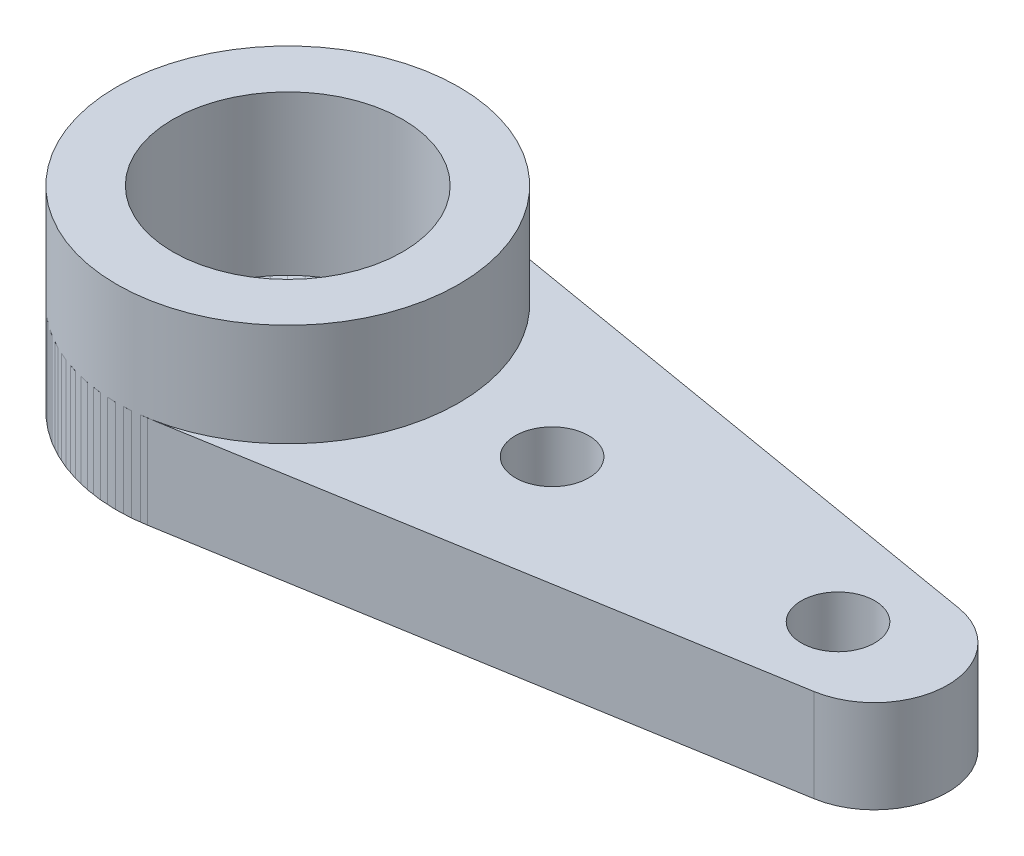
ISO-10303-21;
HEADER;
FILE_DESCRIPTION(('STEP AP214'),'2;1');
FILE_NAME('part.step','',(''),(''),'','','');
FILE_SCHEMA(('AUTOMOTIVE_DESIGN { 1 0 10303 214 1 1 1 1 }'));
ENDSEC;
DATA;
#1=APPLICATION_CONTEXT('core data for automotive mechanical design processes');
#2=APPLICATION_PROTOCOL_DEFINITION('international standard','automotive_design',2000,#1);
#3=PRODUCT_CONTEXT('',#1,'mechanical');
#4=PRODUCT('Part','Part','',(#3));
#5=PRODUCT_RELATED_PRODUCT_CATEGORY('part','',(#4));
#6=PRODUCT_DEFINITION_FORMATION('','',#4);
#7=PRODUCT_DEFINITION_CONTEXT('part definition',#1,'design');
#8=PRODUCT_DEFINITION('design','',#6,#7);
#9=PRODUCT_DEFINITION_SHAPE('','',#8);
#10=(LENGTH_UNIT() NAMED_UNIT(*) SI_UNIT(.MILLI.,.METRE.));
#11=(NAMED_UNIT(*) PLANE_ANGLE_UNIT() SI_UNIT($,.RADIAN.));
#12=(NAMED_UNIT(*) SI_UNIT($,.STERADIAN.) SOLID_ANGLE_UNIT());
#13=UNCERTAINTY_MEASURE_WITH_UNIT(LENGTH_MEASURE(1.E-05),#10,'distance_accuracy_value','');
#14=(GEOMETRIC_REPRESENTATION_CONTEXT(3) GLOBAL_UNCERTAINTY_ASSIGNED_CONTEXT((#13)) GLOBAL_UNIT_ASSIGNED_CONTEXT((#10,
#11,#12)) REPRESENTATION_CONTEXT('',''));
#15=CARTESIAN_POINT('',(0.,0.,0.));
#16=DIRECTION('',(0.,0.,1.));
#17=DIRECTION('',(1.,0.,0.));
#18=AXIS2_PLACEMENT_3D('',#15,#16,#17);
#19=CARTESIAN_POINT('',(0.,1.9,0.));
#20=DIRECTION('',(0.,-1.,0.));
#21=DIRECTION('',(0.,0.,-1.));
#22=AXIS2_PLACEMENT_3D('',#19,#20,#21);
#23=CYLINDRICAL_SURFACE('',#22,1.5);
#24=CARTESIAN_POINT('',(0.,0.,0.));
#25=DIRECTION('',(0.,-1.,0.));
#26=DIRECTION('',(0.,0.,-1.));
#27=AXIS2_PLACEMENT_3D('',#24,#25,#26);
#28=CIRCLE('',#27,1.5);
#29=CARTESIAN_POINT('',(0.,0.,-1.5));
#30=VERTEX_POINT('',#29);
#31=EDGE_CURVE('E112',#30,#30,#28,.T.);
#32=CARTESIAN_POINT('',(0.,0.75,0.));
#33=DIRECTION('',(0.,1.,0.));
#34=DIRECTION('',(0.,0.,1.));
#35=AXIS2_PLACEMENT_3D('',#32,#33,#34);
#36=CIRCLE('',#35,1.5);
#37=CARTESIAN_POINT('',(0.,0.75,-1.5));
#38=VERTEX_POINT('',#37);
#39=EDGE_CURVE('E118',#38,#38,#36,.F.);
#40=CARTESIAN_POINT('',(0.,0.,-1.5));
#41=CARTESIAN_POINT('',(0.,0.00781250000000001,-1.5));
#42=CARTESIAN_POINT('',(0.,0.015625,-1.5));
#43=CARTESIAN_POINT('',(0.,0.03125,-1.5));
#44=CARTESIAN_POINT('',(0.,0.0390625,-1.5));
#45=CARTESIAN_POINT('',(0.,0.0546875,-1.5));
#46=CARTESIAN_POINT('',(0.,0.0625000000000001,-1.5));
#47=CARTESIAN_POINT('',(0.,0.0781250000000001,-1.5));
#48=CARTESIAN_POINT('',(0.,0.0859375000000001,-1.5));
#49=CARTESIAN_POINT('',(0.,0.1015625,-1.5));
#50=CARTESIAN_POINT('',(0.,0.109375,-1.5));
#51=CARTESIAN_POINT('',(0.,0.125,-1.5));
#52=CARTESIAN_POINT('',(0.,0.1328125,-1.5));
#53=CARTESIAN_POINT('',(0.,0.1484375,-1.5));
#54=CARTESIAN_POINT('',(0.,0.15625,-1.5));
#55=CARTESIAN_POINT('',(0.,0.171875,-1.5));
#56=CARTESIAN_POINT('',(0.,0.1796875,-1.5));
#57=CARTESIAN_POINT('',(0.,0.1953125,-1.5));
#58=CARTESIAN_POINT('',(0.,0.203125,-1.5));
#59=CARTESIAN_POINT('',(0.,0.21875,-1.5));
#60=CARTESIAN_POINT('',(0.,0.2265625,-1.5));
#61=CARTESIAN_POINT('',(0.,0.2421875,-1.5));
#62=CARTESIAN_POINT('',(0.,0.25,-1.5));
#63=CARTESIAN_POINT('',(0.,0.265625,-1.5));
#64=CARTESIAN_POINT('',(0.,0.2734375,-1.5));
#65=CARTESIAN_POINT('',(0.,0.2890625,-1.5));
#66=CARTESIAN_POINT('',(0.,0.296875,-1.5));
#67=CARTESIAN_POINT('',(0.,0.3125,-1.5));
#68=CARTESIAN_POINT('',(0.,0.3203125,-1.5));
#69=CARTESIAN_POINT('',(0.,0.3359375,-1.5));
#70=CARTESIAN_POINT('',(0.,0.34375,-1.5));
#71=CARTESIAN_POINT('',(0.,0.359375,-1.5));
#72=CARTESIAN_POINT('',(0.,0.3671875,-1.5));
#73=CARTESIAN_POINT('',(0.,0.3828125,-1.5));
#74=CARTESIAN_POINT('',(0.,0.390625,-1.5));
#75=CARTESIAN_POINT('',(0.,0.40625,-1.5));
#76=CARTESIAN_POINT('',(0.,0.4140625,-1.5));
#77=CARTESIAN_POINT('',(0.,0.4296875,-1.5));
#78=CARTESIAN_POINT('',(0.,0.4375,-1.5));
#79=CARTESIAN_POINT('',(0.,0.453125,-1.5));
#80=CARTESIAN_POINT('',(0.,0.4609375,-1.5));
#81=CARTESIAN_POINT('',(0.,0.4765625,-1.5));
#82=CARTESIAN_POINT('',(0.,0.484375,-1.5));
#83=CARTESIAN_POINT('',(0.,0.5,-1.5));
#84=CARTESIAN_POINT('',(0.,0.5078125,-1.5));
#85=CARTESIAN_POINT('',(0.,0.5234375,-1.5));
#86=CARTESIAN_POINT('',(0.,0.53125,-1.5));
#87=CARTESIAN_POINT('',(0.,0.546875,-1.5));
#88=CARTESIAN_POINT('',(0.,0.5546875,-1.5));
#89=CARTESIAN_POINT('',(0.,0.5703125,-1.5));
#90=CARTESIAN_POINT('',(0.,0.578125,-1.5));
#91=CARTESIAN_POINT('',(0.,0.59375,-1.5));
#92=CARTESIAN_POINT('',(0.,0.6015625,-1.5));
#93=CARTESIAN_POINT('',(0.,0.6171875,-1.5));
#94=CARTESIAN_POINT('',(0.,0.625,-1.5));
#95=CARTESIAN_POINT('',(0.,0.640625,-1.5));
#96=CARTESIAN_POINT('',(0.,0.6484375,-1.5));
#97=CARTESIAN_POINT('',(0.,0.6640625,-1.5));
#98=CARTESIAN_POINT('',(0.,0.671875,-1.5));
#99=CARTESIAN_POINT('',(0.,0.6875,-1.5));
#100=CARTESIAN_POINT('',(0.,0.6953125,-1.5));
#101=CARTESIAN_POINT('',(0.,0.7109375,-1.5));
#102=CARTESIAN_POINT('',(0.,0.71875,-1.5));
#103=CARTESIAN_POINT('',(0.,0.734375,-1.5));
#104=CARTESIAN_POINT('',(0.,0.7421875,-1.5));
#105=CARTESIAN_POINT('',(0.,0.75,-1.5));
#106=B_SPLINE_CURVE_WITH_KNOTS('',3,(#40,#41,#42,#43,#44,#45,#46,#47,#48,#49,#50,#51,#52,#53,
#54,#55,#56,#57,#58,#59,#60,#61,#62,#63,#64,#65,#66,#67,#68,#69,#70,#71,#72,#73,#74,#75,#76,#77,
#78,#79,#80,#81,#82,#83,#84,#85,#86,#87,#88,#89,#90,#91,#92,#93,#94,#95,#96,#97,#98,#99,#100,
#101,#102,#103,#104,#105),.UNSPECIFIED.,.F.,.F.,(4,2,2,2,2,2,2,2,2,2,2,2,2,2,2,2,2,2,2,2,2,2,2,
2,2,2,2,2,2,2,2,2,4),(0.,0.0234375,0.046875,0.0703125000000001,0.0937500000000001,0.1171875,
0.140625,0.1640625,0.1875,0.2109375,0.234375,0.2578125,0.28125,0.3046875,0.328125,0.3515625,
0.375,0.3984375,0.421875,0.4453125,0.46875,0.4921875,0.515625,0.5390625,0.5625,0.5859375,
0.609375,0.6328125,0.65625,0.6796875,0.703125,0.7265625,0.75),.UNSPECIFIED.);
#107=EDGE_CURVE('BSEAM40',#30,#38,#106,.T.);
#108=ORIENTED_EDGE('',*,*,#31,.T.);
#109=ORIENTED_EDGE('',*,*,#39,.F.);
#110=ORIENTED_EDGE('',*,*,#107,.T.);
#111=ORIENTED_EDGE('',*,*,#107,.F.);
#112=EDGE_LOOP('',(#108,#110,#109,#111));
#113=FACE_BOUND('',#112,.T.);
#114=ADVANCED_FACE('F40',(#113),#23,.F.);
#115=CARTESIAN_POINT('',(0.,1.9,0.));
#116=DIRECTION('',(0.,-1.,0.));
#117=DIRECTION('',(0.,0.,-1.));
#118=AXIS2_PLACEMENT_3D('',#115,#116,#117);
#119=CYLINDRICAL_SURFACE('',#118,3.5);
#120=CARTESIAN_POINT('',(0.,0.,0.));
#121=DIRECTION('',(0.,-1.,0.));
#122=DIRECTION('',(0.,0.,-1.));
#123=AXIS2_PLACEMENT_3D('',#120,#121,#122);
#124=CIRCLE('',#123,3.5);
#125=CARTESIAN_POINT('',(0.583333333333334,0.,3.45104654014144));
#126=VERTEX_POINT('',#125);
#127=CARTESIAN_POINT('',(0.583333333333334,0.,-3.45104654014144));
#128=VERTEX_POINT('',#127);
#129=EDGE_CURVE('E108',#126,#128,#124,.T.);
#130=ORIENTED_EDGE('',*,*,#129,.F.);
#131=DIRECTION('',(0.,-1.,0.));
#132=VECTOR('',#131,1.);
#133=CARTESIAN_POINT('',(0.583333333333334,1.9,3.45104654014144));
#134=LINE('',#133,#132);
#135=CARTESIAN_POINT('',(0.583333333333334,1.9,3.45104654014144));
#136=VERTEX_POINT('',#135);
#137=EDGE_CURVE('E12',#136,#126,#134,.T.);
#138=ORIENTED_EDGE('',*,*,#137,.F.);
#139=CARTESIAN_POINT('',(0.,1.9,0.));
#140=DIRECTION('',(0.,-1.,0.));
#141=DIRECTION('',(0.,0.,-1.));
#142=AXIS2_PLACEMENT_3D('',#139,#140,#141);
#143=CIRCLE('',#142,3.5);
#144=CARTESIAN_POINT('',(0.583333333333334,1.9,-3.45104654014144));
#145=VERTEX_POINT('',#144);
#146=EDGE_CURVE('E101',#136,#145,#143,.T.);
#147=ORIENTED_EDGE('',*,*,#146,.T.);
#148=DIRECTION('',(0.,-1.,0.));
#149=VECTOR('',#148,1.);
#150=CARTESIAN_POINT('',(0.583333333333334,1.9,-3.45104654014144));
#151=LINE('',#150,#149);
#152=EDGE_CURVE('E84',#145,#128,#151,.T.);
#153=ORIENTED_EDGE('',*,*,#152,.T.);
#154=EDGE_LOOP('',(#130,#138,#147,#153));
#155=FACE_BOUND('',#154,.T.);
#156=ADVANCED_FACE('F42',(#155),#119,.T.);
#157=CARTESIAN_POINT('',(0.583333333333334,1.9,3.45104654014144));
#158=DIRECTION('',(0.166666666666667,0.,0.986013297183269));
#159=DIRECTION('',(0.986013297183269,0.,-0.166666666666667));
#160=AXIS2_PLACEMENT_3D('',#157,#158,#159);
#161=PLANE('',#160);
#162=DIRECTION('',(-0.986013297183269,0.,0.166666666666667));
#163=VECTOR('',#162,1.);
#164=CARTESIAN_POINT('',(0.583333333333334,0.,3.45104654014144));
#165=LINE('',#164,#163);
#166=CARTESIAN_POINT('',(12.25,0.,1.4790199457749));
#167=VERTEX_POINT('',#166);
#168=EDGE_CURVE('E103',#167,#126,#165,.T.);
#169=ORIENTED_EDGE('',*,*,#168,.F.);
#170=DIRECTION('',(0.,-1.,0.));
#171=VECTOR('',#170,1.);
#172=CARTESIAN_POINT('',(12.25,1.9,1.4790199457749));
#173=LINE('',#172,#171);
#174=CARTESIAN_POINT('',(12.25,1.9,1.4790199457749));
#175=VERTEX_POINT('',#174);
#176=EDGE_CURVE('E50',#175,#167,#173,.T.);
#177=ORIENTED_EDGE('',*,*,#176,.F.);
#178=DIRECTION('',(-0.986013297183269,0.,0.166666666666667));
#179=VECTOR('',#178,1.);
#180=CARTESIAN_POINT('',(0.583333333333334,1.9,3.45104654014144));
#181=LINE('',#180,#179);
#182=EDGE_CURVE('E98',#175,#136,#181,.T.);
#183=ORIENTED_EDGE('',*,*,#182,.T.);
#184=ORIENTED_EDGE('',*,*,#137,.T.);
#185=EDGE_LOOP('',(#169,#177,#183,#184));
#186=FACE_BOUND('',#185,.T.);
#187=ADVANCED_FACE('F144',(#186),#161,.T.);
#188=CARTESIAN_POINT('',(12.,1.9,0.));
#189=DIRECTION('',(0.,-1.,0.));
#190=DIRECTION('',(0.,0.,-1.));
#191=AXIS2_PLACEMENT_3D('',#188,#189,#190);
#192=CYLINDRICAL_SURFACE('',#191,1.5);
#193=CARTESIAN_POINT('',(12.,0.,0.));
#194=DIRECTION('',(0.,-1.,0.));
#195=DIRECTION('',(0.,0.,-1.));
#196=AXIS2_PLACEMENT_3D('',#193,#194,#195);
#197=CIRCLE('',#196,1.5);
#198=CARTESIAN_POINT('',(12.25,0.,-1.4790199457749));
#199=VERTEX_POINT('',#198);
#200=EDGE_CURVE('E92',#199,#167,#197,.T.);
#201=ORIENTED_EDGE('',*,*,#200,.F.);
#202=DIRECTION('',(0.,-1.,0.));
#203=VECTOR('',#202,1.);
#204=CARTESIAN_POINT('',(12.25,1.9,-1.4790199457749));
#205=LINE('',#204,#203);
#206=CARTESIAN_POINT('',(12.25,1.9,-1.4790199457749));
#207=VERTEX_POINT('',#206);
#208=EDGE_CURVE('E87',#207,#199,#205,.T.);
#209=ORIENTED_EDGE('',*,*,#208,.F.);
#210=CARTESIAN_POINT('',(12.,1.9,0.));
#211=DIRECTION('',(0.,-1.,0.));
#212=DIRECTION('',(0.,0.,-1.));
#213=AXIS2_PLACEMENT_3D('',#210,#211,#212);
#214=CIRCLE('',#213,1.5);
#215=EDGE_CURVE('E90',#207,#175,#214,.T.);
#216=ORIENTED_EDGE('',*,*,#215,.T.);
#217=ORIENTED_EDGE('',*,*,#176,.T.);
#218=EDGE_LOOP('',(#201,#209,#216,#217));
#219=FACE_BOUND('',#218,.T.);
#220=ADVANCED_FACE('F89',(#219),#192,.T.);
#221=CARTESIAN_POINT('',(0.583333333333334,1.9,-3.45104654014144));
#222=DIRECTION('',(0.166666666666667,0.,-0.986013297183269));
#223=DIRECTION('',(-0.986013297183269,0.,-0.166666666666667));
#224=AXIS2_PLACEMENT_3D('',#221,#222,#223);
#225=PLANE('',#224);
#226=DIRECTION('',(0.986013297183269,0.,0.166666666666667));
#227=VECTOR('',#226,1.);
#228=CARTESIAN_POINT('',(0.583333333333334,0.,-3.45104654014144));
#229=LINE('',#228,#227);
#230=EDGE_CURVE('E111',#128,#199,#229,.T.);
#231=ORIENTED_EDGE('',*,*,#230,.F.);
#232=ORIENTED_EDGE('',*,*,#152,.F.);
#233=DIRECTION('',(0.986013297183269,0.,0.166666666666667));
#234=VECTOR('',#233,1.);
#235=CARTESIAN_POINT('',(0.583333333333334,1.9,-3.45104654014144));
#236=LINE('',#235,#234);
#237=EDGE_CURVE('E97',#145,#207,#236,.T.);
#238=ORIENTED_EDGE('',*,*,#237,.T.);
#239=ORIENTED_EDGE('',*,*,#208,.T.);
#240=EDGE_LOOP('',(#231,#232,#238,#239));
#241=FACE_BOUND('',#240,.T.);
#242=ADVANCED_FACE('F100',(#241),#225,.T.);
#243=CARTESIAN_POINT('',(0.,1.9,0.));
#244=DIRECTION('',(0.,-1.,0.));
#245=DIRECTION('',(0.,0.,-1.));
#246=AXIS2_PLACEMENT_3D('',#243,#244,#245);
#247=PLANE('',#246);
#248=CARTESIAN_POINT('',(5.40759257124017,1.9,0.));
#249=DIRECTION('',(0.,-1.,0.));
#250=DIRECTION('',(0.,0.,-1.));
#251=AXIS2_PLACEMENT_3D('',#248,#249,#250);
#252=CIRCLE('',#251,0.75);
#253=CARTESIAN_POINT('',(5.40759257124017,1.9,-0.75));
#254=VERTEX_POINT('',#253);
#255=EDGE_CURVE('E170',#254,#254,#252,.T.);
#256=ORIENTED_EDGE('',*,*,#255,.T.);
#257=EDGE_LOOP('',(#256));
#258=FACE_BOUND('',#257,.T.);
#259=CARTESIAN_POINT('',(11.2575925712402,1.9,0.));
#260=DIRECTION('',(0.,-1.,0.));
#261=DIRECTION('',(0.,0.,-1.));
#262=AXIS2_PLACEMENT_3D('',#259,#260,#261);
#263=CIRCLE('',#262,0.75);
#264=CARTESIAN_POINT('',(11.2575925712402,1.9,-0.75));
#265=VERTEX_POINT('',#264);
#266=EDGE_CURVE('E125',#265,#265,#263,.T.);
#267=ORIENTED_EDGE('',*,*,#266,.T.);
#268=EDGE_LOOP('',(#267));
#269=FACE_BOUND('',#268,.T.);
#270=CARTESIAN_POINT('',(0.,1.9,0.));
#271=DIRECTION('',(0.,-1.,0.));
#272=DIRECTION('',(0.,0.,-1.));
#273=AXIS2_PLACEMENT_3D('',#270,#271,#272);
#274=CIRCLE('',#273,2.35);
#275=CARTESIAN_POINT('',(0.,1.9,2.35));
#276=VERTEX_POINT('',#275);
#277=EDGE_CURVE('E44',#276,#276,#274,.T.);
#278=ORIENTED_EDGE('',*,*,#277,.T.);
#279=EDGE_LOOP('',(#278));
#280=FACE_BOUND('',#279,.T.);
#281=ORIENTED_EDGE('',*,*,#146,.F.);
#282=ORIENTED_EDGE('',*,*,#182,.F.);
#283=ORIENTED_EDGE('',*,*,#215,.F.);
#284=ORIENTED_EDGE('',*,*,#237,.F.);
#285=EDGE_LOOP('',(#281,#282,#283,#284));
#286=FACE_BOUND('',#285,.T.);
#287=ADVANCED_FACE('F96',(#258,#269,#280,#286),#247,.F.);
#288=CARTESIAN_POINT('',(0.,0.,0.));
#289=DIRECTION('',(0.,-1.,0.));
#290=DIRECTION('',(0.,0.,-1.));
#291=AXIS2_PLACEMENT_3D('',#288,#289,#290);
#292=PLANE('',#291);
#293=CARTESIAN_POINT('',(5.40759257124017,0.,0.));
#294=DIRECTION('',(0.,-1.,0.));
#295=DIRECTION('',(0.,0.,-1.));
#296=AXIS2_PLACEMENT_3D('',#293,#294,#295);
#297=CIRCLE('',#296,0.75);
#298=CARTESIAN_POINT('',(5.40759257124017,0.,-0.75));
#299=VERTEX_POINT('',#298);
#300=EDGE_CURVE('E195',#299,#299,#297,.T.);
#301=ORIENTED_EDGE('',*,*,#300,.F.);
#302=EDGE_LOOP('',(#301));
#303=FACE_BOUND('',#302,.T.);
#304=CARTESIAN_POINT('',(11.2575925712402,0.,0.));
#305=DIRECTION('',(0.,-1.,0.));
#306=DIRECTION('',(0.,0.,-1.));
#307=AXIS2_PLACEMENT_3D('',#304,#305,#306);
#308=CIRCLE('',#307,0.75);
#309=CARTESIAN_POINT('',(11.2575925712402,0.,-0.75));
#310=VERTEX_POINT('',#309);
#311=EDGE_CURVE('E130',#310,#310,#308,.T.);
#312=ORIENTED_EDGE('',*,*,#311,.F.);
#313=EDGE_LOOP('',(#312));
#314=FACE_BOUND('',#313,.T.);
#315=ORIENTED_EDGE('',*,*,#31,.F.);
#316=EDGE_LOOP('',(#315));
#317=FACE_BOUND('',#316,.T.);
#318=ORIENTED_EDGE('',*,*,#129,.T.);
#319=ORIENTED_EDGE('',*,*,#230,.T.);
#320=ORIENTED_EDGE('',*,*,#200,.T.);
#321=ORIENTED_EDGE('',*,*,#168,.T.);
#322=EDGE_LOOP('',(#318,#319,#320,#321));
#323=FACE_BOUND('',#322,.T.);
#324=ADVANCED_FACE('F138',(#303,#314,#317,#323),#292,.T.);
#325=CARTESIAN_POINT('',(0.,0.75,0.));
#326=DIRECTION('',(0.,1.,0.));
#327=DIRECTION('',(0.,0.,1.));
#328=AXIS2_PLACEMENT_3D('',#325,#326,#327);
#329=CYLINDRICAL_SURFACE('',#328,2.35);
#330=CARTESIAN_POINT('',(0.,0.75,0.));
#331=DIRECTION('',(0.,1.,0.));
#332=DIRECTION('',(0.,0.,1.));
#333=AXIS2_PLACEMENT_3D('',#330,#331,#332);
#334=CIRCLE('',#333,2.35);
#335=CARTESIAN_POINT('',(0.,0.75,2.35));
#336=VERTEX_POINT('',#335);
#337=EDGE_CURVE('E120',#336,#336,#334,.T.);
#338=CARTESIAN_POINT('',(0.,0.75,2.35));
#339=CARTESIAN_POINT('',(0.,0.761979166666667,2.35));
#340=CARTESIAN_POINT('',(0.,0.773958333333334,2.35));
#341=CARTESIAN_POINT('',(0.,0.797916666666667,2.35));
#342=CARTESIAN_POINT('',(0.,0.809895833333333,2.35));
#343=CARTESIAN_POINT('',(0.,0.833854166666667,2.35));
#344=CARTESIAN_POINT('',(0.,0.845833333333334,2.35));
#345=CARTESIAN_POINT('',(0.,0.869791666666667,2.35));
#346=CARTESIAN_POINT('',(0.,0.881770833333334,2.35));
#347=CARTESIAN_POINT('',(0.,0.905729166666667,2.35));
#348=CARTESIAN_POINT('',(0.,0.917708333333334,2.35));
#349=CARTESIAN_POINT('',(0.,0.941666666666667,2.35));
#350=CARTESIAN_POINT('',(0.,0.953645833333334,2.35));
#351=CARTESIAN_POINT('',(0.,0.977604166666667,2.35));
#352=CARTESIAN_POINT('',(0.,0.989583333333333,2.35));
#353=CARTESIAN_POINT('',(0.,1.01354166666667,2.35));
#354=CARTESIAN_POINT('',(0.,1.02552083333333,2.35));
#355=CARTESIAN_POINT('',(0.,1.04947916666667,2.35));
#356=CARTESIAN_POINT('',(0.,1.06145833333333,2.35));
#357=CARTESIAN_POINT('',(0.,1.08541666666667,2.35));
#358=CARTESIAN_POINT('',(0.,1.09739583333333,2.35));
#359=CARTESIAN_POINT('',(0.,1.12135416666667,2.35));
#360=CARTESIAN_POINT('',(0.,1.13333333333333,2.35));
#361=CARTESIAN_POINT('',(0.,1.15729166666667,2.35));
#362=CARTESIAN_POINT('',(0.,1.16927083333333,2.35));
#363=CARTESIAN_POINT('',(0.,1.19322916666667,2.35));
#364=CARTESIAN_POINT('',(0.,1.20520833333333,2.35));
#365=CARTESIAN_POINT('',(0.,1.22916666666667,2.35));
#366=CARTESIAN_POINT('',(0.,1.24114583333333,2.35));
#367=CARTESIAN_POINT('',(0.,1.26510416666667,2.35));
#368=CARTESIAN_POINT('',(0.,1.27708333333333,2.35));
#369=CARTESIAN_POINT('',(0.,1.30104166666667,2.35));
#370=CARTESIAN_POINT('',(0.,1.31302083333333,2.35));
#371=CARTESIAN_POINT('',(0.,1.33697916666667,2.35));
#372=CARTESIAN_POINT('',(0.,1.34895833333333,2.35));
#373=CARTESIAN_POINT('',(0.,1.37291666666667,2.35));
#374=CARTESIAN_POINT('',(0.,1.38489583333333,2.35));
#375=CARTESIAN_POINT('',(0.,1.40885416666667,2.35));
#376=CARTESIAN_POINT('',(0.,1.42083333333333,2.35));
#377=CARTESIAN_POINT('',(0.,1.44479166666667,2.35));
#378=CARTESIAN_POINT('',(0.,1.45677083333333,2.35));
#379=CARTESIAN_POINT('',(0.,1.48072916666667,2.35));
#380=CARTESIAN_POINT('',(0.,1.49270833333333,2.35));
#381=CARTESIAN_POINT('',(0.,1.51666666666667,2.35));
#382=CARTESIAN_POINT('',(0.,1.52864583333333,2.35));
#383=CARTESIAN_POINT('',(0.,1.55260416666667,2.35));
#384=CARTESIAN_POINT('',(0.,1.56458333333333,2.35));
#385=CARTESIAN_POINT('',(0.,1.58854166666667,2.35));
#386=CARTESIAN_POINT('',(0.,1.60052083333333,2.35));
#387=CARTESIAN_POINT('',(0.,1.62447916666667,2.35));
#388=CARTESIAN_POINT('',(0.,1.63645833333333,2.35));
#389=CARTESIAN_POINT('',(0.,1.66041666666667,2.35));
#390=CARTESIAN_POINT('',(0.,1.67239583333333,2.35));
#391=CARTESIAN_POINT('',(0.,1.69635416666667,2.35));
#392=CARTESIAN_POINT('',(0.,1.70833333333333,2.35));
#393=CARTESIAN_POINT('',(0.,1.73229166666667,2.35));
#394=CARTESIAN_POINT('',(0.,1.74427083333333,2.35));
#395=CARTESIAN_POINT('',(0.,1.76822916666667,2.35));
#396=CARTESIAN_POINT('',(0.,1.78020833333333,2.35));
#397=CARTESIAN_POINT('',(0.,1.80416666666667,2.35));
#398=CARTESIAN_POINT('',(0.,1.81614583333333,2.35));
#399=CARTESIAN_POINT('',(0.,1.84010416666667,2.35));
#400=CARTESIAN_POINT('',(0.,1.85208333333333,2.35));
#401=CARTESIAN_POINT('',(0.,1.87604166666667,2.35));
#402=CARTESIAN_POINT('',(0.,1.88802083333333,2.35));
#403=CARTESIAN_POINT('',(0.,1.9,2.35));
#404=B_SPLINE_CURVE_WITH_KNOTS('',3,(#338,#339,#340,#341,#342,#343,#344,#345,#346,#347,#348,
#349,#350,#351,#352,#353,#354,#355,#356,#357,#358,#359,#360,#361,#362,#363,#364,#365,#366,#367,
#368,#369,#370,#371,#372,#373,#374,#375,#376,#377,#378,#379,#380,#381,#382,#383,#384,#385,#386,
#387,#388,#389,#390,#391,#392,#393,#394,#395,#396,#397,#398,#399,#400,#401,#402,#403),
.UNSPECIFIED.,.F.,.F.,(4,2,2,2,2,2,2,2,2,2,2,2,2,2,2,2,2,2,2,2,2,2,2,2,2,2,2,2,2,2,2,2,4),(0.,
0.0359375000000001,0.071875,0.1078125,0.14375,0.1796875,0.215625,0.2515625,0.2875,0.3234375,
0.359375,0.3953125,0.43125,0.4671875,0.503125,0.5390625,0.575,0.6109375,0.646875,0.6828125,
0.71875,0.7546875,0.790625,0.8265625,0.8625,0.8984375,0.934375,0.9703125,1.00625,1.0421875,
1.078125,1.1140625,1.15),.UNSPECIFIED.);
#405=EDGE_CURVE('BSEAM141',#336,#276,#404,.T.);
#406=ORIENTED_EDGE('',*,*,#337,.F.);
#407=ORIENTED_EDGE('',*,*,#277,.F.);
#408=ORIENTED_EDGE('',*,*,#405,.T.);
#409=ORIENTED_EDGE('',*,*,#405,.F.);
#410=EDGE_LOOP('',(#406,#408,#407,#409));
#411=FACE_BOUND('',#410,.T.);
#412=ADVANCED_FACE('F141',(#411),#329,.F.);
#413=CARTESIAN_POINT('',(0.,0.75,0.));
#414=DIRECTION('',(0.,1.,0.));
#415=DIRECTION('',(0.,0.,1.));
#416=AXIS2_PLACEMENT_3D('',#413,#414,#415);
#417=PLANE('',#416);
#418=ORIENTED_EDGE('',*,*,#337,.T.);
#419=EDGE_LOOP('',(#418));
#420=FACE_BOUND('',#419,.T.);
#421=ORIENTED_EDGE('',*,*,#39,.T.);
#422=EDGE_LOOP('',(#421));
#423=FACE_BOUND('',#422,.T.);
#424=ADVANCED_FACE('F176',(#420,#423),#417,.T.);
#425=CARTESIAN_POINT('',(11.2575925712402,4.,0.));
#426=DIRECTION('',(0.,-1.,0.));
#427=DIRECTION('',(0.,0.,-1.));
#428=AXIS2_PLACEMENT_3D('',#425,#426,#427);
#429=CYLINDRICAL_SURFACE('',#428,0.75);
#430=ORIENTED_EDGE('',*,*,#311,.T.);
#431=EDGE_LOOP('',(#430));
#432=FACE_BOUND('',#431,.T.);
#433=ORIENTED_EDGE('',*,*,#266,.F.);
#434=EDGE_LOOP('',(#433));
#435=FACE_BOUND('',#434,.T.);
#436=ADVANCED_FACE('F181',(#432,#435),#429,.F.);
#437=CARTESIAN_POINT('',(5.40759257124017,4.,0.));
#438=DIRECTION('',(0.,-1.,0.));
#439=DIRECTION('',(0.,0.,-1.));
#440=AXIS2_PLACEMENT_3D('',#437,#438,#439);
#441=CYLINDRICAL_SURFACE('',#440,0.75);
#442=ORIENTED_EDGE('',*,*,#300,.T.);
#443=EDGE_LOOP('',(#442));
#444=FACE_BOUND('',#443,.T.);
#445=ORIENTED_EDGE('',*,*,#255,.F.);
#446=EDGE_LOOP('',(#445));
#447=FACE_BOUND('',#446,.T.);
#448=ADVANCED_FACE('F184',(#444,#447),#441,.F.);
#449=CLOSED_SHELL('',(#114,#156,#187,#220,#242,#287,#324,#412,#424,#436,#448));
#450=MANIFOLD_SOLID_BREP('B2',#449);
#451=CARTESIAN_POINT('',(0.,4.,0.));
#452=DIRECTION('',(0.,-1.,0.));
#453=DIRECTION('',(0.,0.,-1.));
#454=AXIS2_PLACEMENT_3D('',#451,#452,#453);
#455=CYLINDRICAL_SURFACE('',#454,1.5);
#456=CARTESIAN_POINT('',(0.,0.,0.));
#457=DIRECTION('',(0.,1.,0.));
#458=DIRECTION('',(0.,0.,1.));
#459=AXIS2_PLACEMENT_3D('',#456,#457,#458);
#460=CIRCLE('',#459,1.5);
#461=CARTESIAN_POINT('',(0.,0.,1.5));
#462=VERTEX_POINT('',#461);
#463=EDGE_CURVE('E269',#462,#462,#460,.T.);
#464=ORIENTED_EDGE('',*,*,#463,.F.);
#465=EDGE_LOOP('',(#464));
#466=FACE_BOUND('',#465,.T.);
#467=CARTESIAN_POINT('',(0.,0.75,0.));
#468=DIRECTION('',(0.,1.,0.));
#469=DIRECTION('',(0.,0.,1.));
#470=AXIS2_PLACEMENT_3D('',#467,#468,#469);
#471=CIRCLE('',#470,1.5);
#472=CARTESIAN_POINT('',(0.,0.75,1.5));
#473=VERTEX_POINT('',#472);
#474=EDGE_CURVE('E260',#473,#473,#471,.T.);
#475=ORIENTED_EDGE('',*,*,#474,.T.);
#476=EDGE_LOOP('',(#475));
#477=FACE_BOUND('',#476,.T.);
#478=ADVANCED_FACE('F256',(#466,#477),#455,.F.);
#479=CARTESIAN_POINT('',(0.,4.,0.));
#480=DIRECTION('',(0.,1.,0.));
#481=DIRECTION('',(0.,0.,1.));
#482=AXIS2_PLACEMENT_3D('',#479,#480,#481);
#483=PLANE('',#482);
#484=CARTESIAN_POINT('',(0.,4.,0.));
#485=DIRECTION('',(0.,1.,0.));
#486=DIRECTION('',(0.,0.,1.));
#487=AXIS2_PLACEMENT_3D('',#484,#485,#486);
#488=CIRCLE('',#487,2.35);
#489=CARTESIAN_POINT('',(0.,4.,2.35));
#490=VERTEX_POINT('',#489);
#491=EDGE_CURVE('E273',#490,#490,#488,.T.);
#492=ORIENTED_EDGE('',*,*,#491,.F.);
#493=EDGE_LOOP('',(#492));
#494=FACE_BOUND('',#493,.T.);
#495=CARTESIAN_POINT('',(0.,4.,0.));
#496=DIRECTION('',(0.,1.,0.));
#497=DIRECTION('',(0.,0.,1.));
#498=AXIS2_PLACEMENT_3D('',#495,#496,#497);
#499=CIRCLE('',#498,3.5);
#500=CARTESIAN_POINT('',(0.,4.,3.5));
#501=VERTEX_POINT('',#500);
#502=EDGE_CURVE('E39',#501,#501,#499,.T.);
#503=ORIENTED_EDGE('',*,*,#502,.T.);
#504=EDGE_LOOP('',(#503));
#505=FACE_BOUND('',#504,.T.);
#506=ADVANCED_FACE('F294',(#494,#505),#483,.T.);
#507=CARTESIAN_POINT('',(0.,0.,0.));
#508=DIRECTION('',(0.,1.,0.));
#509=DIRECTION('',(0.,0.,1.));
#510=AXIS2_PLACEMENT_3D('',#507,#508,#509);
#511=PLANE('',#510);
#512=CARTESIAN_POINT('',(0.,0.,0.));
#513=DIRECTION('',(0.,1.,0.));
#514=DIRECTION('',(0.,0.,1.));
#515=AXIS2_PLACEMENT_3D('',#512,#513,#514);
#516=CIRCLE('',#515,3.5);
#517=CARTESIAN_POINT('',(0.,0.,3.5));
#518=VERTEX_POINT('',#517);
#519=EDGE_CURVE('E264',#518,#518,#516,.T.);
#520=ORIENTED_EDGE('',*,*,#519,.F.);
#521=EDGE_LOOP('',(#520));
#522=FACE_BOUND('',#521,.T.);
#523=ORIENTED_EDGE('',*,*,#463,.T.);
#524=EDGE_LOOP('',(#523));
#525=FACE_BOUND('',#524,.T.);
#526=ADVANCED_FACE('F301',(#522,#525),#511,.F.);
#527=CARTESIAN_POINT('',(0.,4.,0.));
#528=DIRECTION('',(0.,-1.,0.));
#529=DIRECTION('',(0.,0.,-1.));
#530=AXIS2_PLACEMENT_3D('',#527,#528,#529);
#531=CYLINDRICAL_SURFACE('',#530,3.5);
#532=ORIENTED_EDGE('',*,*,#502,.F.);
#533=EDGE_LOOP('',(#532));
#534=FACE_BOUND('',#533,.T.);
#535=ORIENTED_EDGE('',*,*,#519,.T.);
#536=EDGE_LOOP('',(#535));
#537=FACE_BOUND('',#536,.T.);
#538=ADVANCED_FACE('F258',(#534,#537),#531,.T.);
#539=CARTESIAN_POINT('',(0.,0.75,0.));
#540=DIRECTION('',(0.,1.,0.));
#541=DIRECTION('',(0.,0.,1.));
#542=AXIS2_PLACEMENT_3D('',#539,#540,#541);
#543=CYLINDRICAL_SURFACE('',#542,2.35);
#544=CARTESIAN_POINT('',(0.,0.75,0.));
#545=DIRECTION('',(0.,1.,0.));
#546=DIRECTION('',(0.,0.,1.));
#547=AXIS2_PLACEMENT_3D('',#544,#545,#546);
#548=CIRCLE('',#547,2.35);
#549=CARTESIAN_POINT('',(0.,0.75,2.35));
#550=VERTEX_POINT('',#549);
#551=EDGE_CURVE('E276',#550,#550,#548,.T.);
#552=CARTESIAN_POINT('',(0.,0.75,2.35));
#553=CARTESIAN_POINT('',(0.,0.783854166666667,2.35));
#554=CARTESIAN_POINT('',(0.,0.817708333333333,2.35));
#555=CARTESIAN_POINT('',(0.,0.885416666666667,2.35));
#556=CARTESIAN_POINT('',(0.,0.919270833333333,2.35));
#557=CARTESIAN_POINT('',(0.,0.986979166666667,2.35));
#558=CARTESIAN_POINT('',(0.,1.02083333333333,2.35));
#559=CARTESIAN_POINT('',(0.,1.08854166666667,2.35));
#560=CARTESIAN_POINT('',(0.,1.12239583333333,2.35));
#561=CARTESIAN_POINT('',(0.,1.19010416666667,2.35));
#562=CARTESIAN_POINT('',(0.,1.22395833333333,2.35));
#563=CARTESIAN_POINT('',(0.,1.29166666666667,2.35));
#564=CARTESIAN_POINT('',(0.,1.32552083333333,2.35));
#565=CARTESIAN_POINT('',(0.,1.39322916666667,2.35));
#566=CARTESIAN_POINT('',(0.,1.42708333333333,2.35));
#567=CARTESIAN_POINT('',(0.,1.49479166666667,2.35));
#568=CARTESIAN_POINT('',(0.,1.52864583333333,2.35));
#569=CARTESIAN_POINT('',(0.,1.59635416666667,2.35));
#570=CARTESIAN_POINT('',(0.,1.63020833333333,2.35));
#571=CARTESIAN_POINT('',(0.,1.69791666666667,2.35));
#572=CARTESIAN_POINT('',(0.,1.73177083333333,2.35));
#573=CARTESIAN_POINT('',(0.,1.79947916666667,2.35));
#574=CARTESIAN_POINT('',(0.,1.83333333333333,2.35));
#575=CARTESIAN_POINT('',(0.,1.90104166666667,2.35));
#576=CARTESIAN_POINT('',(0.,1.93489583333333,2.35));
#577=CARTESIAN_POINT('',(0.,2.00260416666667,2.35));
#578=CARTESIAN_POINT('',(0.,2.03645833333333,2.35));
#579=CARTESIAN_POINT('',(0.,2.10416666666667,2.35));
#580=CARTESIAN_POINT('',(0.,2.13802083333333,2.35));
#581=CARTESIAN_POINT('',(0.,2.20572916666667,2.35));
#582=CARTESIAN_POINT('',(0.,2.23958333333333,2.35));
#583=CARTESIAN_POINT('',(0.,2.30729166666667,2.35));
#584=CARTESIAN_POINT('',(0.,2.34114583333333,2.35));
#585=CARTESIAN_POINT('',(0.,2.40885416666667,2.35));
#586=CARTESIAN_POINT('',(0.,2.44270833333333,2.35));
#587=CARTESIAN_POINT('',(0.,2.51041666666667,2.35));
#588=CARTESIAN_POINT('',(0.,2.54427083333333,2.35));
#589=CARTESIAN_POINT('',(0.,2.61197916666667,2.35));
#590=CARTESIAN_POINT('',(0.,2.64583333333333,2.35));
#591=CARTESIAN_POINT('',(0.,2.71354166666667,2.35));
#592=CARTESIAN_POINT('',(0.,2.74739583333333,2.35));
#593=CARTESIAN_POINT('',(0.,2.81510416666667,2.35));
#594=CARTESIAN_POINT('',(0.,2.84895833333333,2.35));
#595=CARTESIAN_POINT('',(0.,2.91666666666667,2.35));
#596=CARTESIAN_POINT('',(0.,2.95052083333333,2.35));
#597=CARTESIAN_POINT('',(0.,3.01822916666667,2.35));
#598=CARTESIAN_POINT('',(0.,3.05208333333333,2.35));
#599=CARTESIAN_POINT('',(0.,3.11979166666667,2.35));
#600=CARTESIAN_POINT('',(0.,3.15364583333333,2.35));
#601=CARTESIAN_POINT('',(0.,3.22135416666667,2.35));
#602=CARTESIAN_POINT('',(0.,3.25520833333333,2.35));
#603=CARTESIAN_POINT('',(0.,3.32291666666667,2.35));
#604=CARTESIAN_POINT('',(0.,3.35677083333333,2.35));
#605=CARTESIAN_POINT('',(0.,3.42447916666667,2.35));
#606=CARTESIAN_POINT('',(0.,3.45833333333333,2.35));
#607=CARTESIAN_POINT('',(0.,3.52604166666667,2.35));
#608=CARTESIAN_POINT('',(0.,3.55989583333333,2.35));
#609=CARTESIAN_POINT('',(0.,3.62760416666667,2.35));
#610=CARTESIAN_POINT('',(0.,3.66145833333333,2.35));
#611=CARTESIAN_POINT('',(0.,3.72916666666667,2.35));
#612=CARTESIAN_POINT('',(0.,3.76302083333333,2.35));
#613=CARTESIAN_POINT('',(0.,3.83072916666667,2.35));
#614=CARTESIAN_POINT('',(0.,3.86458333333333,2.35));
#615=CARTESIAN_POINT('',(0.,3.93229166666667,2.35));
#616=CARTESIAN_POINT('',(0.,3.96614583333333,2.35));
#617=CARTESIAN_POINT('',(0.,4.,2.35));
#618=B_SPLINE_CURVE_WITH_KNOTS('',3,(#552,#553,#554,#555,#556,#557,#558,#559,#560,#561,#562,
#563,#564,#565,#566,#567,#568,#569,#570,#571,#572,#573,#574,#575,#576,#577,#578,#579,#580,#581,
#582,#583,#584,#585,#586,#587,#588,#589,#590,#591,#592,#593,#594,#595,#596,#597,#598,#599,#600,
#601,#602,#603,#604,#605,#606,#607,#608,#609,#610,#611,#612,#613,#614,#615,#616,#617),
.UNSPECIFIED.,.F.,.F.,(4,2,2,2,2,2,2,2,2,2,2,2,2,2,2,2,2,2,2,2,2,2,2,2,2,2,2,2,2,2,2,2,4),(0.,
0.1015625,0.203125,0.3046875,0.40625,0.5078125,0.609375,0.7109375,0.8125,0.9140625,1.015625,
1.1171875,1.21875,1.3203125,1.421875,1.5234375,1.625,1.7265625,1.828125,1.9296875,2.03125,
2.1328125,2.234375,2.3359375,2.4375,2.5390625,2.640625,2.7421875,2.84375,2.9453125,3.046875,
3.1484375,3.25),.UNSPECIFIED.);
#619=EDGE_CURVE('BSEAM286',#550,#490,#618,.T.);
#620=ORIENTED_EDGE('',*,*,#551,.F.);
#621=ORIENTED_EDGE('',*,*,#491,.T.);
#622=ORIENTED_EDGE('',*,*,#619,.T.);
#623=ORIENTED_EDGE('',*,*,#619,.F.);
#624=EDGE_LOOP('',(#620,#622,#621,#623));
#625=FACE_BOUND('',#624,.T.);
#626=ADVANCED_FACE('F286',(#625),#543,.F.);
#627=CARTESIAN_POINT('',(0.,0.75,0.));
#628=DIRECTION('',(0.,1.,0.));
#629=DIRECTION('',(0.,0.,1.));
#630=AXIS2_PLACEMENT_3D('',#627,#628,#629);
#631=PLANE('',#630);
#632=ORIENTED_EDGE('',*,*,#474,.F.);
#633=EDGE_LOOP('',(#632));
#634=FACE_BOUND('',#633,.T.);
#635=ORIENTED_EDGE('',*,*,#551,.T.);
#636=EDGE_LOOP('',(#635));
#637=FACE_BOUND('',#636,.T.);
#638=ADVANCED_FACE('F284',(#634,#637),#631,.T.);
#639=CLOSED_SHELL('',(#478,#506,#526,#538,#626,#638));
#640=MANIFOLD_SOLID_BREP('B6',#639);
#641=ADVANCED_BREP_SHAPE_REPRESENTATION('',(#18,#450,#640),#14);
#642=SHAPE_DEFINITION_REPRESENTATION(#9,#641);
ENDSEC;
END-ISO-10303-21;
